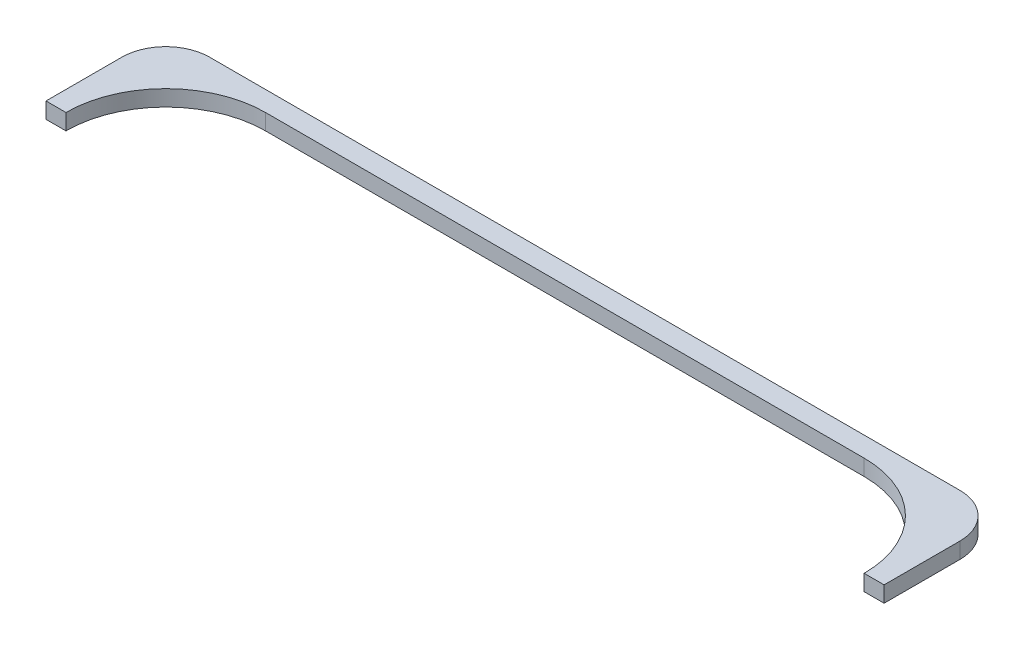
ISO-10303-21;
HEADER;
FILE_DESCRIPTION(('STEP AP214'),'2;1');
FILE_NAME('part.step','',(''),(''),'','','');
FILE_SCHEMA(('AUTOMOTIVE_DESIGN { 1 0 10303 214 1 1 1 1 }'));
ENDSEC;
DATA;
#1=APPLICATION_CONTEXT('core data for automotive mechanical design processes');
#2=APPLICATION_PROTOCOL_DEFINITION('international standard','automotive_design',2000,#1);
#3=PRODUCT_CONTEXT('',#1,'mechanical');
#4=PRODUCT('Part','Part','',(#3));
#5=PRODUCT_RELATED_PRODUCT_CATEGORY('part','',(#4));
#6=PRODUCT_DEFINITION_FORMATION('','',#4);
#7=PRODUCT_DEFINITION_CONTEXT('part definition',#1,'design');
#8=PRODUCT_DEFINITION('design','',#6,#7);
#9=PRODUCT_DEFINITION_SHAPE('','',#8);
#10=(LENGTH_UNIT() NAMED_UNIT(*) SI_UNIT(.MILLI.,.METRE.));
#11=(NAMED_UNIT(*) PLANE_ANGLE_UNIT() SI_UNIT($,.RADIAN.));
#12=(NAMED_UNIT(*) SI_UNIT($,.STERADIAN.) SOLID_ANGLE_UNIT());
#13=UNCERTAINTY_MEASURE_WITH_UNIT(LENGTH_MEASURE(1.E-05),#10,'distance_accuracy_value','');
#14=(GEOMETRIC_REPRESENTATION_CONTEXT(3) GLOBAL_UNCERTAINTY_ASSIGNED_CONTEXT((#13)) GLOBAL_UNIT_ASSIGNED_CONTEXT((#10,
#11,#12)) REPRESENTATION_CONTEXT('',''));
#15=CARTESIAN_POINT('',(0.,0.,0.));
#16=DIRECTION('',(0.,0.,1.));
#17=DIRECTION('',(1.,0.,0.));
#18=AXIS2_PLACEMENT_3D('',#15,#16,#17);
#19=CARTESIAN_POINT('',(-133.35,5.08,19.05));
#20=DIRECTION('',(0.,0.,-1.));
#21=DIRECTION('',(-1.,0.,0.));
#22=AXIS2_PLACEMENT_3D('',#19,#20,#21);
#23=PLANE('',#22);
#24=DIRECTION('',(0.,-1.,0.));
#25=VECTOR('',#24,1.);
#26=CARTESIAN_POINT('',(-127.,348.249467593546,19.05));
#27=LINE('',#26,#25);
#28=CARTESIAN_POINT('',(-127.,5.08000000000008,19.05));
#29=VERTEX_POINT('',#28);
#30=CARTESIAN_POINT('',(-127.,1.11022302462516E-13,19.05));
#31=VERTEX_POINT('',#30);
#32=EDGE_CURVE('E123',#29,#31,#27,.T.);
#33=ORIENTED_EDGE('',*,*,#32,.F.);
#34=DIRECTION('',(1.,0.,0.));
#35=VECTOR('',#34,1.);
#36=CARTESIAN_POINT('',(-133.35,5.08,19.05));
#37=LINE('',#36,#35);
#38=CARTESIAN_POINT('',(-133.35,5.08,19.05));
#39=VERTEX_POINT('',#38);
#40=EDGE_CURVE('E135',#39,#29,#37,.T.);
#41=ORIENTED_EDGE('',*,*,#40,.F.);
#42=DIRECTION('',(0.,-1.,0.));
#43=VECTOR('',#42,1.);
#44=CARTESIAN_POINT('',(-133.35,5.08,19.05));
#45=LINE('',#44,#43);
#46=CARTESIAN_POINT('',(-133.35,0.,19.05));
#47=VERTEX_POINT('',#46);
#48=EDGE_CURVE('E159',#39,#47,#45,.T.);
#49=ORIENTED_EDGE('',*,*,#48,.T.);
#50=DIRECTION('',(1.,0.,0.));
#51=VECTOR('',#50,1.);
#52=CARTESIAN_POINT('',(-133.35,0.,19.05));
#53=LINE('',#52,#51);
#54=EDGE_CURVE('E144',#47,#31,#53,.T.);
#55=ORIENTED_EDGE('',*,*,#54,.T.);
#56=EDGE_LOOP('',(#33,#41,#49,#55));
#57=FACE_BOUND('',#56,.T.);
#58=ADVANCED_FACE('F33',(#57),#23,.F.);
#59=CARTESIAN_POINT('',(0.,5.08,0.));
#60=DIRECTION('',(0.,-1.,0.));
#61=DIRECTION('',(0.,0.,-1.));
#62=AXIS2_PLACEMENT_3D('',#59,#60,#61);
#63=PLANE('',#62);
#64=DIRECTION('',(-1.,0.,0.));
#65=VECTOR('',#64,1.);
#66=CARTESIAN_POINT('',(-133.35,5.08,-19.05));
#67=LINE('',#66,#65);
#68=CARTESIAN_POINT('',(119.38,5.08,-19.05));
#69=VERTEX_POINT('',#68);
#70=CARTESIAN_POINT('',(-119.38,5.08,-19.05));
#71=VERTEX_POINT('',#70);
#72=EDGE_CURVE('E143',#69,#71,#67,.T.);
#73=ORIENTED_EDGE('',*,*,#72,.T.);
#74=CARTESIAN_POINT('',(-119.38,5.08,-5.08000000000001));
#75=DIRECTION('',(0.,-1.,0.));
#76=DIRECTION('',(0.,0.,-1.));
#77=AXIS2_PLACEMENT_3D('',#74,#75,#76);
#78=CIRCLE('',#77,13.97);
#79=CARTESIAN_POINT('',(-133.35,5.08,-5.08000000000001));
#80=VERTEX_POINT('',#79);
#81=EDGE_CURVE('E41',#71,#80,#78,.F.);
#82=ORIENTED_EDGE('',*,*,#81,.T.);
#83=DIRECTION('',(0.,0.,1.));
#84=VECTOR('',#83,1.);
#85=CARTESIAN_POINT('',(-133.35,5.08,19.05));
#86=LINE('',#85,#84);
#87=EDGE_CURVE('E146',#80,#39,#86,.T.);
#88=ORIENTED_EDGE('',*,*,#87,.T.);
#89=ORIENTED_EDGE('',*,*,#40,.T.);
#90=CARTESIAN_POINT('',(-95.2500000000001,5.07999999999997,19.05));
#91=DIRECTION('',(0.,-1.,0.));
#92=DIRECTION('',(0.,0.,-1.));
#93=AXIS2_PLACEMENT_3D('',#90,#91,#92);
#94=CIRCLE('',#93,31.75);
#95=CARTESIAN_POINT('',(-95.2500000000001,5.08000000000008,-12.7));
#96=VERTEX_POINT('',#95);
#97=EDGE_CURVE('E122',#96,#29,#94,.F.);
#98=ORIENTED_EDGE('',*,*,#97,.F.);
#99=DIRECTION('',(-1.,0.,0.));
#100=VECTOR('',#99,1.);
#101=CARTESIAN_POINT('',(0.,5.08,-12.7));
#102=LINE('',#101,#100);
#103=CARTESIAN_POINT('',(95.25,5.08,-12.7000000000006));
#104=VERTEX_POINT('',#103);
#105=EDGE_CURVE('E112',#104,#96,#102,.T.);
#106=ORIENTED_EDGE('',*,*,#105,.F.);
#107=CARTESIAN_POINT('',(95.2500000000002,5.07999999999997,19.0499999999994));
#108=DIRECTION('',(0.,-1.,0.));
#109=DIRECTION('',(0.,0.,-1.));
#110=AXIS2_PLACEMENT_3D('',#107,#108,#109);
#111=CIRCLE('',#110,31.75);
#112=CARTESIAN_POINT('',(127.,5.08,19.05));
#113=VERTEX_POINT('',#112);
#114=EDGE_CURVE('E130',#104,#113,#111,.T.);
#115=ORIENTED_EDGE('',*,*,#114,.T.);
#116=CARTESIAN_POINT('',(133.35,5.08,19.05));
#117=VERTEX_POINT('',#116);
#118=EDGE_CURVE('E148',#113,#117,#37,.T.);
#119=ORIENTED_EDGE('',*,*,#118,.T.);
#120=DIRECTION('',(0.,0.,-1.));
#121=VECTOR('',#120,1.);
#122=CARTESIAN_POINT('',(133.35,5.08,19.05));
#123=LINE('',#122,#121);
#124=CARTESIAN_POINT('',(133.35,5.08,-5.08000000000001));
#125=VERTEX_POINT('',#124);
#126=EDGE_CURVE('E141',#117,#125,#123,.T.);
#127=ORIENTED_EDGE('',*,*,#126,.T.);
#128=CARTESIAN_POINT('',(119.38,5.08,-5.08000000000001));
#129=DIRECTION('',(0.,-1.,0.));
#130=DIRECTION('',(0.,0.,-1.));
#131=AXIS2_PLACEMENT_3D('',#128,#129,#130);
#132=CIRCLE('',#131,13.97);
#133=EDGE_CURVE('E178',#125,#69,#132,.F.);
#134=ORIENTED_EDGE('',*,*,#133,.T.);
#135=EDGE_LOOP('',(#73,#82,#88,#89,#98,#106,#115,#119,#127,#134));
#136=FACE_BOUND('',#135,.T.);
#137=ADVANCED_FACE('F133',(#136),#63,.F.);
#138=CARTESIAN_POINT('',(0.,0.,0.));
#139=DIRECTION('',(0.,-1.,0.));
#140=DIRECTION('',(0.,0.,-1.));
#141=AXIS2_PLACEMENT_3D('',#138,#139,#140);
#142=PLANE('',#141);
#143=DIRECTION('',(0.,0.,1.));
#144=VECTOR('',#143,1.);
#145=CARTESIAN_POINT('',(-133.35,0.,19.05));
#146=LINE('',#145,#144);
#147=CARTESIAN_POINT('',(-133.35,0.,-5.08000000000001));
#148=VERTEX_POINT('',#147);
#149=EDGE_CURVE('E152',#148,#47,#146,.T.);
#150=ORIENTED_EDGE('',*,*,#149,.F.);
#151=CARTESIAN_POINT('',(-119.38,0.,-5.08000000000001));
#152=DIRECTION('',(0.,-1.,0.));
#153=DIRECTION('',(0.,0.,-1.));
#154=AXIS2_PLACEMENT_3D('',#151,#152,#153);
#155=CIRCLE('',#154,13.97);
#156=CARTESIAN_POINT('',(-119.38,0.,-19.05));
#157=VERTEX_POINT('',#156);
#158=EDGE_CURVE('E172',#148,#157,#155,.T.);
#159=ORIENTED_EDGE('',*,*,#158,.T.);
#160=DIRECTION('',(-1.,0.,0.));
#161=VECTOR('',#160,1.);
#162=CARTESIAN_POINT('',(-133.35,0.,-19.05));
#163=LINE('',#162,#161);
#164=CARTESIAN_POINT('',(119.38,0.,-19.05));
#165=VERTEX_POINT('',#164);
#166=EDGE_CURVE('E138',#165,#157,#163,.T.);
#167=ORIENTED_EDGE('',*,*,#166,.F.);
#168=CARTESIAN_POINT('',(119.38,0.,-5.08000000000001));
#169=DIRECTION('',(0.,-1.,0.));
#170=DIRECTION('',(0.,0.,-1.));
#171=AXIS2_PLACEMENT_3D('',#168,#169,#170);
#172=CIRCLE('',#171,13.97);
#173=CARTESIAN_POINT('',(133.35,0.,-5.08000000000001));
#174=VERTEX_POINT('',#173);
#175=EDGE_CURVE('E170',#165,#174,#172,.T.);
#176=ORIENTED_EDGE('',*,*,#175,.T.);
#177=DIRECTION('',(0.,0.,-1.));
#178=VECTOR('',#177,1.);
#179=CARTESIAN_POINT('',(133.35,0.,19.05));
#180=LINE('',#179,#178);
#181=CARTESIAN_POINT('',(133.35,0.,19.05));
#182=VERTEX_POINT('',#181);
#183=EDGE_CURVE('E136',#182,#174,#180,.T.);
#184=ORIENTED_EDGE('',*,*,#183,.F.);
#185=CARTESIAN_POINT('',(127.,0.,19.05));
#186=VERTEX_POINT('',#185);
#187=EDGE_CURVE('E154',#186,#182,#53,.T.);
#188=ORIENTED_EDGE('',*,*,#187,.F.);
#189=CARTESIAN_POINT('',(95.2500000000002,0.,19.0499999999994));
#190=DIRECTION('',(0.,-1.,0.));
#191=DIRECTION('',(0.,0.,-1.));
#192=AXIS2_PLACEMENT_3D('',#189,#190,#191);
#193=CIRCLE('',#192,31.75);
#194=CARTESIAN_POINT('',(95.25,0.,-12.7000000000006));
#195=VERTEX_POINT('',#194);
#196=EDGE_CURVE('E206',#195,#186,#193,.T.);
#197=ORIENTED_EDGE('',*,*,#196,.F.);
#198=DIRECTION('',(-1.,0.,0.));
#199=VECTOR('',#198,1.);
#200=CARTESIAN_POINT('',(0.,0.,-12.7));
#201=LINE('',#200,#199);
#202=CARTESIAN_POINT('',(-95.2500000000001,1.11022302462516E-13,-12.7));
#203=VERTEX_POINT('',#202);
#204=EDGE_CURVE('E162',#195,#203,#201,.T.);
#205=ORIENTED_EDGE('',*,*,#204,.T.);
#206=CARTESIAN_POINT('',(-95.2500000000001,0.,19.05));
#207=DIRECTION('',(0.,-1.,0.));
#208=DIRECTION('',(0.,0.,-1.));
#209=AXIS2_PLACEMENT_3D('',#206,#207,#208);
#210=CIRCLE('',#209,31.75);
#211=EDGE_CURVE('E129',#203,#31,#210,.F.);
#212=ORIENTED_EDGE('',*,*,#211,.T.);
#213=ORIENTED_EDGE('',*,*,#54,.F.);
#214=EDGE_LOOP('',(#150,#159,#167,#176,#184,#188,#197,#205,#212,#213));
#215=FACE_BOUND('',#214,.T.);
#216=ADVANCED_FACE('F190',(#215),#142,.T.);
#217=CARTESIAN_POINT('',(133.35,5.08,19.05));
#218=DIRECTION('',(-1.,0.,0.));
#219=DIRECTION('',(0.,0.,1.));
#220=AXIS2_PLACEMENT_3D('',#217,#218,#219);
#221=PLANE('',#220);
#222=ORIENTED_EDGE('',*,*,#183,.T.);
#223=DIRECTION('',(0.,-1.,0.));
#224=VECTOR('',#223,1.);
#225=CARTESIAN_POINT('',(133.35,5.08,-5.08000000000001));
#226=LINE('',#225,#224);
#227=EDGE_CURVE('E11',#174,#125,#226,.F.);
#228=ORIENTED_EDGE('',*,*,#227,.T.);
#229=ORIENTED_EDGE('',*,*,#126,.F.);
#230=DIRECTION('',(0.,-1.,0.));
#231=VECTOR('',#230,1.);
#232=CARTESIAN_POINT('',(133.35,5.08,19.05));
#233=LINE('',#232,#231);
#234=EDGE_CURVE('E149',#117,#182,#233,.T.);
#235=ORIENTED_EDGE('',*,*,#234,.T.);
#236=EDGE_LOOP('',(#222,#228,#229,#235));
#237=FACE_BOUND('',#236,.T.);
#238=ADVANCED_FACE('F198',(#237),#221,.F.);
#239=CARTESIAN_POINT('',(-133.35,5.08,-19.05));
#240=DIRECTION('',(0.,0.,1.));
#241=DIRECTION('',(1.,0.,0.));
#242=AXIS2_PLACEMENT_3D('',#239,#240,#241);
#243=PLANE('',#242);
#244=ORIENTED_EDGE('',*,*,#166,.T.);
#245=DIRECTION('',(0.,-1.,0.));
#246=VECTOR('',#245,1.);
#247=CARTESIAN_POINT('',(-119.38,5.08,-19.05));
#248=LINE('',#247,#246);
#249=EDGE_CURVE('E54',#157,#71,#248,.F.);
#250=ORIENTED_EDGE('',*,*,#249,.T.);
#251=ORIENTED_EDGE('',*,*,#72,.F.);
#252=DIRECTION('',(0.,-1.,0.));
#253=VECTOR('',#252,1.);
#254=CARTESIAN_POINT('',(119.38,5.08,-19.05));
#255=LINE('',#254,#253);
#256=EDGE_CURVE('E174',#69,#165,#255,.T.);
#257=ORIENTED_EDGE('',*,*,#256,.T.);
#258=EDGE_LOOP('',(#244,#250,#251,#257));
#259=FACE_BOUND('',#258,.T.);
#260=ADVANCED_FACE('F192',(#259),#243,.F.);
#261=CARTESIAN_POINT('',(-133.35,5.08,19.05));
#262=DIRECTION('',(1.,0.,0.));
#263=DIRECTION('',(0.,0.,-1.));
#264=AXIS2_PLACEMENT_3D('',#261,#262,#263);
#265=PLANE('',#264);
#266=ORIENTED_EDGE('',*,*,#87,.F.);
#267=DIRECTION('',(0.,-1.,0.));
#268=VECTOR('',#267,1.);
#269=CARTESIAN_POINT('',(-133.35,5.08,-5.08000000000001));
#270=LINE('',#269,#268);
#271=EDGE_CURVE('E167',#80,#148,#270,.T.);
#272=ORIENTED_EDGE('',*,*,#271,.T.);
#273=ORIENTED_EDGE('',*,*,#149,.T.);
#274=ORIENTED_EDGE('',*,*,#48,.F.);
#275=EDGE_LOOP('',(#266,#272,#273,#274));
#276=FACE_BOUND('',#275,.T.);
#277=ADVANCED_FACE('F185',(#276),#265,.F.);
#278=ORIENTED_EDGE('',*,*,#118,.F.);
#279=DIRECTION('',(0.,-1.,0.));
#280=VECTOR('',#279,1.);
#281=CARTESIAN_POINT('',(127.,341.899467593546,19.05));
#282=LINE('',#281,#280);
#283=EDGE_CURVE('E165',#113,#186,#282,.T.);
#284=ORIENTED_EDGE('',*,*,#283,.T.);
#285=ORIENTED_EDGE('',*,*,#187,.T.);
#286=ORIENTED_EDGE('',*,*,#234,.F.);
#287=EDGE_LOOP('',(#278,#284,#285,#286));
#288=FACE_BOUND('',#287,.T.);
#289=ADVANCED_FACE('F202',(#288),#23,.F.);
#290=CARTESIAN_POINT('',(-95.2500000000001,348.249467593546,19.05));
#291=DIRECTION('',(0.,-1.,0.));
#292=DIRECTION('',(0.,0.,-1.));
#293=AXIS2_PLACEMENT_3D('',#290,#291,#292);
#294=CYLINDRICAL_SURFACE('',#293,31.75);
#295=DIRECTION('',(0.,-1.,0.));
#296=VECTOR('',#295,1.);
#297=CARTESIAN_POINT('',(-95.2500000000001,348.249467593546,-12.7));
#298=LINE('',#297,#296);
#299=EDGE_CURVE('E115',#96,#203,#298,.T.);
#300=ORIENTED_EDGE('',*,*,#299,.F.);
#301=ORIENTED_EDGE('',*,*,#97,.T.);
#302=ORIENTED_EDGE('',*,*,#32,.T.);
#303=ORIENTED_EDGE('',*,*,#211,.F.);
#304=EDGE_LOOP('',(#300,#301,#302,#303));
#305=FACE_BOUND('',#304,.T.);
#306=ADVANCED_FACE('F126',(#305),#294,.F.);
#307=CARTESIAN_POINT('',(-95.2500000000001,348.249467593546,-12.7));
#308=DIRECTION('',(0.,0.,1.));
#309=DIRECTION('',(1.,0.,0.));
#310=AXIS2_PLACEMENT_3D('',#307,#308,#309);
#311=PLANE('',#310);
#312=ORIENTED_EDGE('',*,*,#204,.F.);
#313=DIRECTION('',(0.,-1.,0.));
#314=VECTOR('',#313,1.);
#315=CARTESIAN_POINT('',(95.25,341.899467593546,-12.7000000000006));
#316=LINE('',#315,#314);
#317=EDGE_CURVE('E118',#104,#195,#316,.T.);
#318=ORIENTED_EDGE('',*,*,#317,.F.);
#319=ORIENTED_EDGE('',*,*,#105,.T.);
#320=ORIENTED_EDGE('',*,*,#299,.T.);
#321=EDGE_LOOP('',(#312,#318,#319,#320));
#322=FACE_BOUND('',#321,.T.);
#323=ADVANCED_FACE('F114',(#322),#311,.T.);
#324=CARTESIAN_POINT('',(95.2500000000002,341.899467593546,19.0499999999994));
#325=DIRECTION('',(0.,-1.,0.));
#326=DIRECTION('',(0.,0.,-1.));
#327=AXIS2_PLACEMENT_3D('',#324,#325,#326);
#328=CYLINDRICAL_SURFACE('',#327,31.75);
#329=ORIENTED_EDGE('',*,*,#114,.F.);
#330=ORIENTED_EDGE('',*,*,#317,.T.);
#331=ORIENTED_EDGE('',*,*,#196,.T.);
#332=ORIENTED_EDGE('',*,*,#283,.F.);
#333=EDGE_LOOP('',(#329,#330,#331,#332));
#334=FACE_BOUND('',#333,.T.);
#335=ADVANCED_FACE('F208',(#334),#328,.F.);
#336=CARTESIAN_POINT('',(-119.38,5.08,-5.08000000000001));
#337=DIRECTION('',(0.,-1.,0.));
#338=DIRECTION('',(0.,0.,-1.));
#339=AXIS2_PLACEMENT_3D('',#336,#337,#338);
#340=CYLINDRICAL_SURFACE('',#339,13.97);
#341=ORIENTED_EDGE('',*,*,#81,.F.);
#342=ORIENTED_EDGE('',*,*,#249,.F.);
#343=ORIENTED_EDGE('',*,*,#158,.F.);
#344=ORIENTED_EDGE('',*,*,#271,.F.);
#345=EDGE_LOOP('',(#341,#342,#343,#344));
#346=FACE_BOUND('',#345,.T.);
#347=ADVANCED_FACE('F187',(#346),#340,.T.);
#348=CARTESIAN_POINT('',(119.38,5.08,-5.08000000000001));
#349=DIRECTION('',(0.,-1.,0.));
#350=DIRECTION('',(0.,0.,-1.));
#351=AXIS2_PLACEMENT_3D('',#348,#349,#350);
#352=CYLINDRICAL_SURFACE('',#351,13.97);
#353=ORIENTED_EDGE('',*,*,#133,.F.);
#354=ORIENTED_EDGE('',*,*,#227,.F.);
#355=ORIENTED_EDGE('',*,*,#175,.F.);
#356=ORIENTED_EDGE('',*,*,#256,.F.);
#357=EDGE_LOOP('',(#353,#354,#355,#356));
#358=FACE_BOUND('',#357,.T.);
#359=ADVANCED_FACE('F35',(#358),#352,.T.);
#360=CLOSED_SHELL('',(#58,#137,#216,#238,#260,#277,#289,#306,#323,#335,#347,#359));
#361=MANIFOLD_SOLID_BREP('B2',#360);
#362=ADVANCED_BREP_SHAPE_REPRESENTATION('',(#18,#361),#14);
#363=SHAPE_DEFINITION_REPRESENTATION(#9,#362);
ENDSEC;
END-ISO-10303-21;
